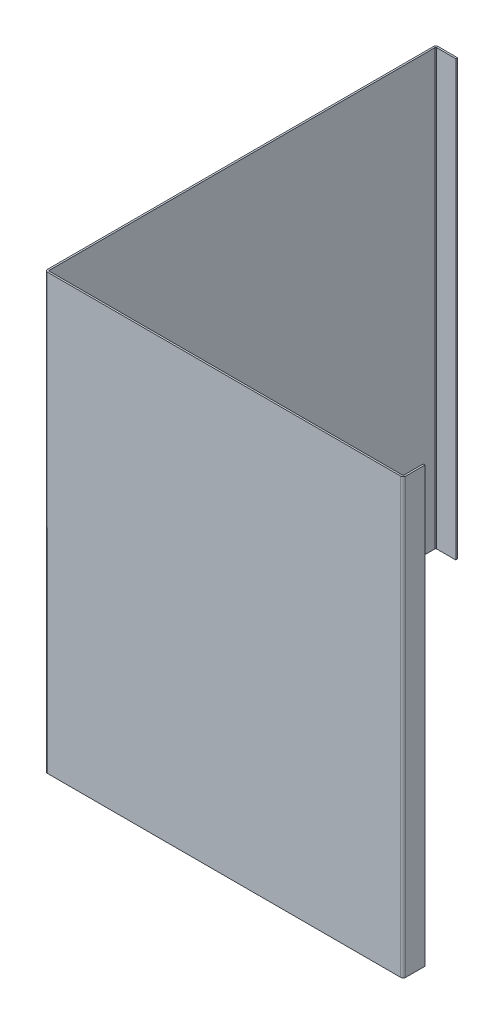
ISO-10303-21;
HEADER;
FILE_DESCRIPTION(('STEP AP214'),'2;1');
FILE_NAME('part.step','',(''),(''),'','','');
FILE_SCHEMA(('AUTOMOTIVE_DESIGN { 1 0 10303 214 1 1 1 1 }'));
ENDSEC;
DATA;
#1=APPLICATION_CONTEXT('core data for automotive mechanical design processes');
#2=APPLICATION_PROTOCOL_DEFINITION('international standard','automotive_design',2000,#1);
#3=PRODUCT_CONTEXT('',#1,'mechanical');
#4=PRODUCT('Part','Part','',(#3));
#5=PRODUCT_RELATED_PRODUCT_CATEGORY('part','',(#4));
#6=PRODUCT_DEFINITION_FORMATION('','',#4);
#7=PRODUCT_DEFINITION_CONTEXT('part definition',#1,'design');
#8=PRODUCT_DEFINITION('design','',#6,#7);
#9=PRODUCT_DEFINITION_SHAPE('','',#8);
#10=(LENGTH_UNIT() NAMED_UNIT(*) SI_UNIT(.MILLI.,.METRE.));
#11=(NAMED_UNIT(*) PLANE_ANGLE_UNIT() SI_UNIT($,.RADIAN.));
#12=(NAMED_UNIT(*) SI_UNIT($,.STERADIAN.) SOLID_ANGLE_UNIT());
#13=UNCERTAINTY_MEASURE_WITH_UNIT(LENGTH_MEASURE(1.E-05),#10,'distance_accuracy_value','');
#14=(GEOMETRIC_REPRESENTATION_CONTEXT(3) GLOBAL_UNCERTAINTY_ASSIGNED_CONTEXT((#13)) GLOBAL_UNIT_ASSIGNED_CONTEXT((#10,
#11,#12)) REPRESENTATION_CONTEXT('',''));
#15=CARTESIAN_POINT('',(0.,0.,0.));
#16=DIRECTION('',(0.,0.,1.));
#17=DIRECTION('',(1.,0.,0.));
#18=AXIS2_PLACEMENT_3D('',#15,#16,#17);
#19=CARTESIAN_POINT('',(1.5875,-200.,360.));
#20=DIRECTION('',(-1.,0.,0.));
#21=DIRECTION('',(0.,-1.,0.));
#22=AXIS2_PLACEMENT_3D('',#19,#20,#21);
#23=PLANE('',#22);
#24=DIRECTION('',(0.,1.,0.));
#25=VECTOR('',#24,1.);
#26=CARTESIAN_POINT('',(1.58749999999996,200.,2.3241));
#27=LINE('',#26,#25);
#28=CARTESIAN_POINT('',(1.58749999999996,200.,2.3241));
#29=VERTEX_POINT('',#28);
#30=CARTESIAN_POINT('',(1.58749999999996,-200.,2.3241));
#31=VERTEX_POINT('',#30);
#32=EDGE_CURVE('E265',#29,#31,#27,.F.);
#33=ORIENTED_EDGE('',*,*,#32,.F.);
#34=DIRECTION('',(0.,0.,-1.));
#35=VECTOR('',#34,1.);
#36=CARTESIAN_POINT('',(1.58749999999993,200.,360.));
#37=LINE('',#36,#35);
#38=CARTESIAN_POINT('',(1.58749999999996,200.,357.6759));
#39=VERTEX_POINT('',#38);
#40=EDGE_CURVE('E13',#39,#29,#37,.T.);
#41=ORIENTED_EDGE('',*,*,#40,.F.);
#42=DIRECTION('',(0.,-1.,0.));
#43=VECTOR('',#42,1.);
#44=CARTESIAN_POINT('',(1.58749999999996,-200.,357.6759));
#45=LINE('',#44,#43);
#46=CARTESIAN_POINT('',(1.58749999999996,-200.,357.6759));
#47=VERTEX_POINT('',#46);
#48=EDGE_CURVE('E356',#47,#39,#45,.F.);
#49=ORIENTED_EDGE('',*,*,#48,.F.);
#50=DIRECTION('',(0.,0.,-1.));
#51=VECTOR('',#50,1.);
#52=CARTESIAN_POINT('',(1.5875,-200.,360.));
#53=LINE('',#52,#51);
#54=EDGE_CURVE('E362',#47,#31,#53,.T.);
#55=ORIENTED_EDGE('',*,*,#54,.T.);
#56=EDGE_LOOP('',(#33,#41,#49,#55));
#57=FACE_BOUND('',#56,.T.);
#58=ADVANCED_FACE('F96',(#57),#23,.F.);
#59=CARTESIAN_POINT('',(0.,-200.,360.));
#60=DIRECTION('',(-1.,0.,0.));
#61=DIRECTION('',(0.,-1.,0.));
#62=AXIS2_PLACEMENT_3D('',#59,#60,#61);
#63=PLANE('',#62);
#64=DIRECTION('',(0.,0.,-1.));
#65=VECTOR('',#64,1.);
#66=CARTESIAN_POINT('',(0.,200.,360.));
#67=LINE('',#66,#65);
#68=CARTESIAN_POINT('',(0.,200.,357.6759));
#69=VERTEX_POINT('',#68);
#70=CARTESIAN_POINT('',(0.,200.,2.3241));
#71=VERTEX_POINT('',#70);
#72=EDGE_CURVE('E103',#69,#71,#67,.T.);
#73=ORIENTED_EDGE('',*,*,#72,.T.);
#74=DIRECTION('',(0.,1.,0.));
#75=VECTOR('',#74,1.);
#76=CARTESIAN_POINT('',(0.,200.,2.3241));
#77=LINE('',#76,#75);
#78=CARTESIAN_POINT('',(0.,-200.,2.3241));
#79=VERTEX_POINT('',#78);
#80=EDGE_CURVE('E252',#71,#79,#77,.F.);
#81=ORIENTED_EDGE('',*,*,#80,.T.);
#82=DIRECTION('',(0.,0.,-1.));
#83=VECTOR('',#82,1.);
#84=CARTESIAN_POINT('',(0.,-200.,360.));
#85=LINE('',#84,#83);
#86=CARTESIAN_POINT('',(0.,-200.,357.6759));
#87=VERTEX_POINT('',#86);
#88=EDGE_CURVE('E367',#87,#79,#85,.T.);
#89=ORIENTED_EDGE('',*,*,#88,.F.);
#90=DIRECTION('',(0.,-1.,0.));
#91=VECTOR('',#90,1.);
#92=CARTESIAN_POINT('',(0.,-200.,357.6759));
#93=LINE('',#92,#91);
#94=EDGE_CURVE('E345',#87,#69,#93,.F.);
#95=ORIENTED_EDGE('',*,*,#94,.T.);
#96=EDGE_LOOP('',(#73,#81,#89,#95));
#97=FACE_BOUND('',#96,.T.);
#98=ADVANCED_FACE('F372',(#97),#63,.T.);
#99=CARTESIAN_POINT('',(0.,200.,360.));
#100=DIRECTION('',(0.,1.,0.));
#101=DIRECTION('',(0.,0.,1.));
#102=AXIS2_PLACEMENT_3D('',#99,#100,#101);
#103=PLANE('',#102);
#104=ORIENTED_EDGE('',*,*,#40,.T.);
#105=DIRECTION('',(-1.,0.,0.));
#106=VECTOR('',#105,1.);
#107=CARTESIAN_POINT('',(1.58749999999996,200.,2.3241));
#108=LINE('',#107,#106);
#109=EDGE_CURVE('E259',#29,#71,#108,.T.);
#110=ORIENTED_EDGE('',*,*,#109,.T.);
#111=ORIENTED_EDGE('',*,*,#72,.F.);
#112=DIRECTION('',(-1.,0.,0.));
#113=VECTOR('',#112,1.);
#114=CARTESIAN_POINT('',(1.58749999999996,200.,357.6759));
#115=LINE('',#114,#113);
#116=EDGE_CURVE('E360',#39,#69,#115,.T.);
#117=ORIENTED_EDGE('',*,*,#116,.F.);
#118=EDGE_LOOP('',(#104,#110,#111,#117));
#119=FACE_BOUND('',#118,.T.);
#120=ADVANCED_FACE('F376',(#119),#103,.T.);
#121=CARTESIAN_POINT('',(330.,-200.,360.000000000001));
#122=DIRECTION('',(0.,1.,0.));
#123=DIRECTION('',(-1.,0.,0.));
#124=AXIS2_PLACEMENT_3D('',#121,#122,#123);
#125=PLANE('',#124);
#126=DIRECTION('',(0.,0.,1.));
#127=VECTOR('',#126,1.);
#128=CARTESIAN_POINT('',(327.6759,-200.,358.412500000001));
#129=LINE('',#128,#127);
#130=CARTESIAN_POINT('',(327.6759,-200.,358.412500000001));
#131=VERTEX_POINT('',#130);
#132=CARTESIAN_POINT('',(327.6759,-200.,360.000000000001));
#133=VERTEX_POINT('',#132);
#134=EDGE_CURVE('E312',#131,#133,#129,.T.);
#135=ORIENTED_EDGE('',*,*,#134,.T.);
#136=DIRECTION('',(1.,0.,0.));
#137=VECTOR('',#136,1.);
#138=CARTESIAN_POINT('',(-1.24959425652168E-12,-200.,360.));
#139=LINE('',#138,#137);
#140=CARTESIAN_POINT('',(2.3241,-200.,360.));
#141=VERTEX_POINT('',#140);
#142=EDGE_CURVE('E330',#141,#133,#139,.T.);
#143=ORIENTED_EDGE('',*,*,#142,.F.);
#144=DIRECTION('',(0.,0.,-1.));
#145=VECTOR('',#144,1.);
#146=CARTESIAN_POINT('',(2.3241,-200.,358.4125));
#147=LINE('',#146,#145);
#148=CARTESIAN_POINT('',(2.32409999999994,-200.,358.4125));
#149=VERTEX_POINT('',#148);
#150=EDGE_CURVE('E338',#149,#141,#147,.F.);
#151=ORIENTED_EDGE('',*,*,#150,.F.);
#152=DIRECTION('',(-1.,0.,0.));
#153=VECTOR('',#152,1.);
#154=CARTESIAN_POINT('',(330.,-200.,358.412500000001));
#155=LINE('',#154,#153);
#156=EDGE_CURVE('E334',#149,#131,#155,.F.);
#157=ORIENTED_EDGE('',*,*,#156,.T.);
#158=EDGE_LOOP('',(#135,#143,#151,#157));
#159=FACE_BOUND('',#158,.T.);
#160=ADVANCED_FACE('F420',(#159),#125,.F.);
#161=CARTESIAN_POINT('',(1.58749999999992,200.,360.));
#162=DIRECTION('',(0.,-1.,0.));
#163=DIRECTION('',(1.,0.,0.));
#164=AXIS2_PLACEMENT_3D('',#161,#162,#163);
#165=PLANE('',#164);
#166=DIRECTION('',(0.,0.,1.));
#167=VECTOR('',#166,1.);
#168=CARTESIAN_POINT('',(327.6759,200.,358.412500000001));
#169=LINE('',#168,#167);
#170=CARTESIAN_POINT('',(327.6759,200.,358.412500000001));
#171=VERTEX_POINT('',#170);
#172=CARTESIAN_POINT('',(327.6759,200.,360.000000000001));
#173=VERTEX_POINT('',#172);
#174=EDGE_CURVE('E321',#171,#173,#169,.T.);
#175=ORIENTED_EDGE('',*,*,#174,.F.);
#176=DIRECTION('',(1.,0.,0.));
#177=VECTOR('',#176,1.);
#178=CARTESIAN_POINT('',(1.58749999999993,200.,358.4125));
#179=LINE('',#178,#177);
#180=CARTESIAN_POINT('',(2.32409999999994,200.,358.4125));
#181=VERTEX_POINT('',#180);
#182=EDGE_CURVE('E332',#171,#181,#179,.F.);
#183=ORIENTED_EDGE('',*,*,#182,.T.);
#184=DIRECTION('',(0.,0.,-1.));
#185=VECTOR('',#184,1.);
#186=CARTESIAN_POINT('',(2.32409999999988,200.,360.));
#187=LINE('',#186,#185);
#188=CARTESIAN_POINT('',(2.32409999999993,200.,360.));
#189=VERTEX_POINT('',#188);
#190=EDGE_CURVE('E324',#181,#189,#187,.F.);
#191=ORIENTED_EDGE('',*,*,#190,.T.);
#192=DIRECTION('',(-1.,0.,0.));
#193=VECTOR('',#192,1.);
#194=CARTESIAN_POINT('',(-1.31720575271169E-12,200.,360.));
#195=LINE('',#194,#193);
#196=EDGE_CURVE('E327',#173,#189,#195,.T.);
#197=ORIENTED_EDGE('',*,*,#196,.F.);
#198=EDGE_LOOP('',(#175,#183,#191,#197));
#199=FACE_BOUND('',#198,.T.);
#200=ADVANCED_FACE('F443',(#199),#165,.F.);
#201=CARTESIAN_POINT('',(-1.28340000461669E-12,0.,360.));
#202=DIRECTION('',(0.,0.,-1.));
#203=DIRECTION('',(-1.,0.,0.));
#204=AXIS2_PLACEMENT_3D('',#201,#202,#203);
#205=PLANE('',#204);
#206=DIRECTION('',(0.,-1.,0.));
#207=VECTOR('',#206,1.);
#208=CARTESIAN_POINT('',(327.6759,-200.,360.000000000001));
#209=LINE('',#208,#207);
#210=EDGE_CURVE('E306',#133,#173,#209,.F.);
#211=ORIENTED_EDGE('',*,*,#210,.T.);
#212=ORIENTED_EDGE('',*,*,#196,.T.);
#213=DIRECTION('',(0.,-1.,0.));
#214=VECTOR('',#213,1.);
#215=CARTESIAN_POINT('',(2.32409999999988,200.,360.));
#216=LINE('',#215,#214);
#217=EDGE_CURVE('E336',#141,#189,#216,.F.);
#218=ORIENTED_EDGE('',*,*,#217,.F.);
#219=ORIENTED_EDGE('',*,*,#142,.T.);
#220=EDGE_LOOP('',(#211,#212,#218,#219));
#221=FACE_BOUND('',#220,.T.);
#222=ADVANCED_FACE('F447',(#221),#205,.F.);
#223=CARTESIAN_POINT('',(-1.27785727799127E-12,0.,358.4125));
#224=DIRECTION('',(0.,0.,-1.));
#225=DIRECTION('',(-1.,0.,0.));
#226=AXIS2_PLACEMENT_3D('',#223,#224,#225);
#227=PLANE('',#226);
#228=ORIENTED_EDGE('',*,*,#182,.F.);
#229=DIRECTION('',(0.,-1.,0.));
#230=VECTOR('',#229,1.);
#231=CARTESIAN_POINT('',(327.6759,-200.,358.412500000001));
#232=LINE('',#231,#230);
#233=EDGE_CURVE('E110',#131,#171,#232,.F.);
#234=ORIENTED_EDGE('',*,*,#233,.F.);
#235=ORIENTED_EDGE('',*,*,#156,.F.);
#236=DIRECTION('',(0.,-1.,0.));
#237=VECTOR('',#236,1.);
#238=CARTESIAN_POINT('',(2.32409999999988,200.,358.4125));
#239=LINE('',#238,#237);
#240=EDGE_CURVE('E341',#181,#149,#239,.T.);
#241=ORIENTED_EDGE('',*,*,#240,.F.);
#242=EDGE_LOOP('',(#228,#234,#235,#241));
#243=FACE_BOUND('',#242,.T.);
#244=ADVANCED_FACE('F425',(#243),#227,.T.);
#245=CARTESIAN_POINT('',(1.5875,-200.,360.));
#246=DIRECTION('',(0.,-1.,0.));
#247=DIRECTION('',(0.,0.,-1.));
#248=AXIS2_PLACEMENT_3D('',#245,#246,#247);
#249=PLANE('',#248);
#250=DIRECTION('',(-1.,0.,0.));
#251=VECTOR('',#250,1.);
#252=CARTESIAN_POINT('',(1.58749999999996,-200.,2.3241));
#253=LINE('',#252,#251);
#254=EDGE_CURVE('E270',#31,#79,#253,.T.);
#255=ORIENTED_EDGE('',*,*,#254,.F.);
#256=ORIENTED_EDGE('',*,*,#54,.F.);
#257=DIRECTION('',(-1.,0.,0.));
#258=VECTOR('',#257,1.);
#259=CARTESIAN_POINT('',(1.58749999999996,-200.,357.6759));
#260=LINE('',#259,#258);
#261=EDGE_CURVE('E350',#47,#87,#260,.T.);
#262=ORIENTED_EDGE('',*,*,#261,.T.);
#263=ORIENTED_EDGE('',*,*,#88,.T.);
#264=EDGE_LOOP('',(#255,#256,#262,#263));
#265=FACE_BOUND('',#264,.T.);
#266=ADVANCED_FACE('F392',(#265),#249,.T.);
#267=CARTESIAN_POINT('',(2.32409999999994,200.,357.6759));
#268=DIRECTION('',(0.,1.,0.));
#269=DIRECTION('',(0.,0.,1.));
#270=AXIS2_PLACEMENT_3D('',#267,#268,#269);
#271=PLANE('',#270);
#272=ORIENTED_EDGE('',*,*,#190,.F.);
#273=CARTESIAN_POINT('',(2.32409999999994,200.,357.6759));
#274=DIRECTION('',(0.,-1.,0.));
#275=DIRECTION('',(0.,0.,-1.));
#276=AXIS2_PLACEMENT_3D('',#273,#274,#275);
#277=CIRCLE('',#276,0.736599999999976);
#278=EDGE_CURVE('E353',#39,#181,#277,.F.);
#279=ORIENTED_EDGE('',*,*,#278,.F.);
#280=ORIENTED_EDGE('',*,*,#116,.T.);
#281=CARTESIAN_POINT('',(2.32409999999994,200.,357.6759));
#282=DIRECTION('',(0.,-1.,0.));
#283=DIRECTION('',(0.,0.,-1.));
#284=AXIS2_PLACEMENT_3D('',#281,#282,#283);
#285=CIRCLE('',#284,2.32409999999998);
#286=EDGE_CURVE('E118',#69,#189,#285,.F.);
#287=ORIENTED_EDGE('',*,*,#286,.T.);
#288=EDGE_LOOP('',(#272,#279,#280,#287));
#289=FACE_BOUND('',#288,.T.);
#290=ADVANCED_FACE('F424',(#289),#271,.T.);
#291=CARTESIAN_POINT('',(2.32409999999994,-200.,357.6759));
#292=DIRECTION('',(0.,1.,0.));
#293=DIRECTION('',(0.,0.,1.));
#294=AXIS2_PLACEMENT_3D('',#291,#292,#293);
#295=PLANE('',#294);
#296=CARTESIAN_POINT('',(2.32409999999994,-200.,357.6759));
#297=DIRECTION('',(0.,-1.,0.));
#298=DIRECTION('',(0.,0.,-1.));
#299=AXIS2_PLACEMENT_3D('',#296,#297,#298);
#300=CIRCLE('',#299,0.736599999999976);
#301=EDGE_CURVE('E329',#149,#47,#300,.T.);
#302=ORIENTED_EDGE('',*,*,#301,.F.);
#303=ORIENTED_EDGE('',*,*,#150,.T.);
#304=CARTESIAN_POINT('',(2.32409999999994,-200.,357.6759));
#305=DIRECTION('',(0.,-1.,0.));
#306=DIRECTION('',(0.,0.,-1.));
#307=AXIS2_PLACEMENT_3D('',#304,#305,#306);
#308=CIRCLE('',#307,2.32409999999998);
#309=EDGE_CURVE('E348',#141,#87,#308,.T.);
#310=ORIENTED_EDGE('',*,*,#309,.T.);
#311=ORIENTED_EDGE('',*,*,#261,.F.);
#312=EDGE_LOOP('',(#302,#303,#310,#311));
#313=FACE_BOUND('',#312,.T.);
#314=ADVANCED_FACE('F426',(#313),#295,.F.);
#315=CARTESIAN_POINT('',(2.32409999999994,-200.,357.6759));
#316=DIRECTION('',(0.,-1.,0.));
#317=DIRECTION('',(0.,0.,1.));
#318=AXIS2_PLACEMENT_3D('',#315,#316,#317);
#319=CYLINDRICAL_SURFACE('',#318,2.32409999999998);
#320=ORIENTED_EDGE('',*,*,#94,.F.);
#321=ORIENTED_EDGE('',*,*,#309,.F.);
#322=ORIENTED_EDGE('',*,*,#217,.T.);
#323=ORIENTED_EDGE('',*,*,#286,.F.);
#324=EDGE_LOOP('',(#320,#321,#322,#323));
#325=FACE_BOUND('',#324,.T.);
#326=ADVANCED_FACE('F429',(#325),#319,.T.);
#327=CARTESIAN_POINT('',(2.32409999999994,-200.,357.6759));
#328=DIRECTION('',(0.,-1.,0.));
#329=DIRECTION('',(0.,0.,1.));
#330=AXIS2_PLACEMENT_3D('',#327,#328,#329);
#331=CYLINDRICAL_SURFACE('',#330,0.736599999999976);
#332=ORIENTED_EDGE('',*,*,#48,.T.);
#333=ORIENTED_EDGE('',*,*,#278,.T.);
#334=ORIENTED_EDGE('',*,*,#240,.T.);
#335=ORIENTED_EDGE('',*,*,#301,.T.);
#336=EDGE_LOOP('',(#332,#333,#334,#335));
#337=FACE_BOUND('',#336,.T.);
#338=ADVANCED_FACE('F434',(#337),#331,.F.);
#339=CARTESIAN_POINT('',(327.6759,200.,357.675900000001));
#340=DIRECTION('',(0.,1.,0.));
#341=DIRECTION('',(0.,0.,1.));
#342=AXIS2_PLACEMENT_3D('',#339,#340,#341);
#343=PLANE('',#342);
#344=DIRECTION('',(-1.,0.,0.));
#345=VECTOR('',#344,1.);
#346=CARTESIAN_POINT('',(330.,200.,357.675900000001));
#347=LINE('',#346,#345);
#348=CARTESIAN_POINT('',(328.4125,200.,357.675900000001));
#349=VERTEX_POINT('',#348);
#350=CARTESIAN_POINT('',(330.,200.,357.675900000001));
#351=VERTEX_POINT('',#350);
#352=EDGE_CURVE('E273',#349,#351,#347,.F.);
#353=ORIENTED_EDGE('',*,*,#352,.F.);
#354=CARTESIAN_POINT('',(327.6759,200.,357.675900000001));
#355=DIRECTION('',(0.,-1.,0.));
#356=DIRECTION('',(0.,0.,-1.));
#357=AXIS2_PLACEMENT_3D('',#354,#355,#356);
#358=CIRCLE('',#357,0.736599999999921);
#359=EDGE_CURVE('E315',#171,#349,#358,.F.);
#360=ORIENTED_EDGE('',*,*,#359,.F.);
#361=ORIENTED_EDGE('',*,*,#174,.T.);
#362=CARTESIAN_POINT('',(327.6759,200.,357.675900000001));
#363=DIRECTION('',(0.,-1.,0.));
#364=DIRECTION('',(0.,0.,-1.));
#365=AXIS2_PLACEMENT_3D('',#362,#363,#364);
#366=CIRCLE('',#365,2.32409999999992);
#367=EDGE_CURVE('E308',#173,#351,#366,.F.);
#368=ORIENTED_EDGE('',*,*,#367,.T.);
#369=EDGE_LOOP('',(#353,#360,#361,#368));
#370=FACE_BOUND('',#369,.T.);
#371=ADVANCED_FACE('F437',(#370),#343,.T.);
#372=CARTESIAN_POINT('',(327.6759,-200.,357.675900000001));
#373=DIRECTION('',(0.,1.,0.));
#374=DIRECTION('',(0.,0.,1.));
#375=AXIS2_PLACEMENT_3D('',#372,#373,#374);
#376=PLANE('',#375);
#377=CARTESIAN_POINT('',(327.6759,-200.,357.675900000001));
#378=DIRECTION('',(0.,-1.,0.));
#379=DIRECTION('',(0.,0.,-1.));
#380=AXIS2_PLACEMENT_3D('',#377,#378,#379);
#381=CIRCLE('',#380,0.736599999999921);
#382=CARTESIAN_POINT('',(328.4125,-200.,357.675900000001));
#383=VERTEX_POINT('',#382);
#384=EDGE_CURVE('E279',#383,#131,#381,.T.);
#385=ORIENTED_EDGE('',*,*,#384,.F.);
#386=DIRECTION('',(-1.,0.,0.));
#387=VECTOR('',#386,1.);
#388=CARTESIAN_POINT('',(328.4125,-200.,357.675900000001));
#389=LINE('',#388,#387);
#390=CARTESIAN_POINT('',(330.,-200.,357.675900000001));
#391=VERTEX_POINT('',#390);
#392=EDGE_CURVE('E299',#383,#391,#389,.F.);
#393=ORIENTED_EDGE('',*,*,#392,.T.);
#394=CARTESIAN_POINT('',(327.6759,-200.,357.675900000001));
#395=DIRECTION('',(0.,-1.,0.));
#396=DIRECTION('',(0.,0.,-1.));
#397=AXIS2_PLACEMENT_3D('',#394,#395,#396);
#398=CIRCLE('',#397,2.32409999999992);
#399=EDGE_CURVE('E309',#391,#133,#398,.T.);
#400=ORIENTED_EDGE('',*,*,#399,.T.);
#401=ORIENTED_EDGE('',*,*,#134,.F.);
#402=EDGE_LOOP('',(#385,#393,#400,#401));
#403=FACE_BOUND('',#402,.T.);
#404=ADVANCED_FACE('F454',(#403),#376,.F.);
#405=CARTESIAN_POINT('',(327.6759,-200.,357.675900000001));
#406=DIRECTION('',(0.,-1.,0.));
#407=DIRECTION('',(1.,0.,0.));
#408=AXIS2_PLACEMENT_3D('',#405,#406,#407);
#409=CYLINDRICAL_SURFACE('',#408,2.32409999999992);
#410=ORIENTED_EDGE('',*,*,#210,.F.);
#411=ORIENTED_EDGE('',*,*,#399,.F.);
#412=DIRECTION('',(0.,-1.,0.));
#413=VECTOR('',#412,1.);
#414=CARTESIAN_POINT('',(330.,200.,357.675900000001));
#415=LINE('',#414,#413);
#416=EDGE_CURVE('E297',#391,#351,#415,.F.);
#417=ORIENTED_EDGE('',*,*,#416,.T.);
#418=ORIENTED_EDGE('',*,*,#367,.F.);
#419=EDGE_LOOP('',(#410,#411,#417,#418));
#420=FACE_BOUND('',#419,.T.);
#421=ADVANCED_FACE('F457',(#420),#409,.T.);
#422=CARTESIAN_POINT('',(327.6759,-200.,357.675900000001));
#423=DIRECTION('',(0.,-1.,0.));
#424=DIRECTION('',(1.,0.,0.));
#425=AXIS2_PLACEMENT_3D('',#422,#423,#424);
#426=CYLINDRICAL_SURFACE('',#425,0.736599999999921);
#427=ORIENTED_EDGE('',*,*,#233,.T.);
#428=ORIENTED_EDGE('',*,*,#359,.T.);
#429=DIRECTION('',(0.,-1.,0.));
#430=VECTOR('',#429,1.);
#431=CARTESIAN_POINT('',(328.4125,200.,357.675900000001));
#432=LINE('',#431,#430);
#433=EDGE_CURVE('E302',#349,#383,#432,.T.);
#434=ORIENTED_EDGE('',*,*,#433,.T.);
#435=ORIENTED_EDGE('',*,*,#384,.T.);
#436=EDGE_LOOP('',(#427,#428,#434,#435));
#437=FACE_BOUND('',#436,.T.);
#438=ADVANCED_FACE('F462',(#437),#426,.F.);
#439=CARTESIAN_POINT('',(330.,-200.,340.000000000001));
#440=DIRECTION('',(0.,1.,0.));
#441=DIRECTION('',(-1.,0.,0.));
#442=AXIS2_PLACEMENT_3D('',#439,#440,#441);
#443=PLANE('',#442);
#444=ORIENTED_EDGE('',*,*,#392,.F.);
#445=DIRECTION('',(0.,0.,1.));
#446=VECTOR('',#445,1.);
#447=CARTESIAN_POINT('',(328.4125,-200.,340.000000000001));
#448=LINE('',#447,#446);
#449=CARTESIAN_POINT('',(328.4125,-200.,340.000000000001));
#450=VERTEX_POINT('',#449);
#451=EDGE_CURVE('E295',#383,#450,#448,.F.);
#452=ORIENTED_EDGE('',*,*,#451,.T.);
#453=DIRECTION('',(-1.,0.,0.));
#454=VECTOR('',#453,1.);
#455=CARTESIAN_POINT('',(330.,-200.,340.000000000001));
#456=LINE('',#455,#454);
#457=CARTESIAN_POINT('',(330.,-200.,340.000000000001));
#458=VERTEX_POINT('',#457);
#459=EDGE_CURVE('E276',#458,#450,#456,.T.);
#460=ORIENTED_EDGE('',*,*,#459,.F.);
#461=DIRECTION('',(0.,0.,-1.));
#462=VECTOR('',#461,1.);
#463=CARTESIAN_POINT('',(330.000000000002,-200.,1.99535181352998E-12));
#464=LINE('',#463,#462);
#465=EDGE_CURVE('E288',#391,#458,#464,.T.);
#466=ORIENTED_EDGE('',*,*,#465,.F.);
#467=EDGE_LOOP('',(#444,#452,#460,#466));
#468=FACE_BOUND('',#467,.T.);
#469=ADVANCED_FACE('F465',(#468),#443,.F.);
#470=CARTESIAN_POINT('',(330.,200.,358.412500000001));
#471=DIRECTION('',(0.,-1.,0.));
#472=DIRECTION('',(1.,0.,0.));
#473=AXIS2_PLACEMENT_3D('',#470,#471,#472);
#474=PLANE('',#473);
#475=ORIENTED_EDGE('',*,*,#352,.T.);
#476=DIRECTION('',(0.,0.,1.));
#477=VECTOR('',#476,1.);
#478=CARTESIAN_POINT('',(330.000000000002,200.,1.99535181352998E-12));
#479=LINE('',#478,#477);
#480=CARTESIAN_POINT('',(330.,200.,340.000000000001));
#481=VERTEX_POINT('',#480);
#482=EDGE_CURVE('E283',#481,#351,#479,.T.);
#483=ORIENTED_EDGE('',*,*,#482,.F.);
#484=DIRECTION('',(-1.,0.,0.));
#485=VECTOR('',#484,1.);
#486=CARTESIAN_POINT('',(330.,200.,340.000000000001));
#487=LINE('',#486,#485);
#488=CARTESIAN_POINT('',(328.4125,200.,340.000000000001));
#489=VERTEX_POINT('',#488);
#490=EDGE_CURVE('E280',#481,#489,#487,.T.);
#491=ORIENTED_EDGE('',*,*,#490,.T.);
#492=DIRECTION('',(0.,0.,-1.));
#493=VECTOR('',#492,1.);
#494=CARTESIAN_POINT('',(328.4125,200.,358.412500000001));
#495=LINE('',#494,#493);
#496=EDGE_CURVE('E290',#489,#349,#495,.F.);
#497=ORIENTED_EDGE('',*,*,#496,.T.);
#498=EDGE_LOOP('',(#475,#483,#491,#497));
#499=FACE_BOUND('',#498,.T.);
#500=ADVANCED_FACE('F472',(#499),#474,.F.);
#501=CARTESIAN_POINT('',(330.000000000002,0.,1.99535181352998E-12));
#502=DIRECTION('',(-1.,0.,0.));
#503=DIRECTION('',(0.,0.,1.));
#504=AXIS2_PLACEMENT_3D('',#501,#502,#503);
#505=PLANE('',#504);
#506=ORIENTED_EDGE('',*,*,#416,.F.);
#507=ORIENTED_EDGE('',*,*,#465,.T.);
#508=DIRECTION('',(0.,1.,0.));
#509=VECTOR('',#508,1.);
#510=CARTESIAN_POINT('',(330.,0.,340.000000000001));
#511=LINE('',#510,#509);
#512=EDGE_CURVE('E286',#458,#481,#511,.T.);
#513=ORIENTED_EDGE('',*,*,#512,.T.);
#514=ORIENTED_EDGE('',*,*,#482,.T.);
#515=EDGE_LOOP('',(#506,#507,#513,#514));
#516=FACE_BOUND('',#515,.T.);
#517=ADVANCED_FACE('F481',(#516),#505,.F.);
#518=CARTESIAN_POINT('',(328.412500000002,0.,1.98417409126898E-12));
#519=DIRECTION('',(-1.,0.,0.));
#520=DIRECTION('',(0.,0.,1.));
#521=AXIS2_PLACEMENT_3D('',#518,#519,#520);
#522=PLANE('',#521);
#523=ORIENTED_EDGE('',*,*,#451,.F.);
#524=ORIENTED_EDGE('',*,*,#433,.F.);
#525=ORIENTED_EDGE('',*,*,#496,.F.);
#526=DIRECTION('',(0.,-1.,0.));
#527=VECTOR('',#526,1.);
#528=CARTESIAN_POINT('',(328.4125,200.,340.000000000001));
#529=LINE('',#528,#527);
#530=EDGE_CURVE('E293',#450,#489,#529,.F.);
#531=ORIENTED_EDGE('',*,*,#530,.F.);
#532=EDGE_LOOP('',(#523,#524,#525,#531));
#533=FACE_BOUND('',#532,.T.);
#534=ADVANCED_FACE('F477',(#533),#522,.T.);
#535=CARTESIAN_POINT('',(330.,200.,340.000000000001));
#536=DIRECTION('',(0.,0.,1.));
#537=DIRECTION('',(1.,0.,0.));
#538=AXIS2_PLACEMENT_3D('',#535,#536,#537);
#539=PLANE('',#538);
#540=ORIENTED_EDGE('',*,*,#530,.T.);
#541=ORIENTED_EDGE('',*,*,#490,.F.);
#542=ORIENTED_EDGE('',*,*,#512,.F.);
#543=ORIENTED_EDGE('',*,*,#459,.T.);
#544=EDGE_LOOP('',(#540,#541,#542,#543));
#545=FACE_BOUND('',#544,.T.);
#546=ADVANCED_FACE('F474',(#545),#539,.F.);
#547=CARTESIAN_POINT('',(2.32409999999996,-200.,2.3241));
#548=DIRECTION('',(0.,-1.,0.));
#549=DIRECTION('',(0.,0.,-1.));
#550=AXIS2_PLACEMENT_3D('',#547,#548,#549);
#551=PLANE('',#550);
#552=DIRECTION('',(0.,0.,1.));
#553=VECTOR('',#552,1.);
#554=CARTESIAN_POINT('',(2.3241,-200.,0.));
#555=LINE('',#554,#553);
#556=CARTESIAN_POINT('',(2.32409999999996,-200.,1.5875));
#557=VERTEX_POINT('',#556);
#558=CARTESIAN_POINT('',(2.32409999999995,-200.,0.));
#559=VERTEX_POINT('',#558);
#560=EDGE_CURVE('E235',#557,#559,#555,.F.);
#561=ORIENTED_EDGE('',*,*,#560,.F.);
#562=CARTESIAN_POINT('',(2.32409999999996,-200.,2.3241));
#563=DIRECTION('',(0.,1.,0.));
#564=DIRECTION('',(0.,0.,1.));
#565=AXIS2_PLACEMENT_3D('',#562,#563,#564);
#566=CIRCLE('',#565,0.7366);
#567=EDGE_CURVE('E262',#31,#557,#566,.F.);
#568=ORIENTED_EDGE('',*,*,#567,.F.);
#569=ORIENTED_EDGE('',*,*,#254,.T.);
#570=CARTESIAN_POINT('',(2.32409999999996,-200.,2.3241));
#571=DIRECTION('',(0.,1.,0.));
#572=DIRECTION('',(0.,0.,1.));
#573=AXIS2_PLACEMENT_3D('',#570,#571,#572);
#574=CIRCLE('',#573,2.3241);
#575=EDGE_CURVE('E255',#79,#559,#574,.F.);
#576=ORIENTED_EDGE('',*,*,#575,.T.);
#577=EDGE_LOOP('',(#561,#568,#569,#576));
#578=FACE_BOUND('',#577,.T.);
#579=ADVANCED_FACE('F394',(#578),#551,.T.);
#580=CARTESIAN_POINT('',(2.32409999999996,200.,2.3241));
#581=DIRECTION('',(0.,-1.,0.));
#582=DIRECTION('',(0.,0.,-1.));
#583=AXIS2_PLACEMENT_3D('',#580,#581,#582);
#584=PLANE('',#583);
#585=CARTESIAN_POINT('',(2.32409999999996,200.,2.3241));
#586=DIRECTION('',(0.,1.,0.));
#587=DIRECTION('',(0.,0.,1.));
#588=AXIS2_PLACEMENT_3D('',#585,#586,#587);
#589=CIRCLE('',#588,0.7366);
#590=CARTESIAN_POINT('',(2.32409999999996,200.,1.5875));
#591=VERTEX_POINT('',#590);
#592=EDGE_CURVE('E267',#591,#29,#589,.T.);
#593=ORIENTED_EDGE('',*,*,#592,.F.);
#594=DIRECTION('',(0.,0.,1.));
#595=VECTOR('',#594,1.);
#596=CARTESIAN_POINT('',(2.32409999999992,200.,1.5875));
#597=LINE('',#596,#595);
#598=CARTESIAN_POINT('',(2.32409999999992,200.,0.));
#599=VERTEX_POINT('',#598);
#600=EDGE_CURVE('E246',#591,#599,#597,.F.);
#601=ORIENTED_EDGE('',*,*,#600,.T.);
#602=CARTESIAN_POINT('',(2.32409999999996,200.,2.3241));
#603=DIRECTION('',(0.,1.,0.));
#604=DIRECTION('',(0.,0.,1.));
#605=AXIS2_PLACEMENT_3D('',#602,#603,#604);
#606=CIRCLE('',#605,2.3241);
#607=EDGE_CURVE('E256',#599,#71,#606,.T.);
#608=ORIENTED_EDGE('',*,*,#607,.T.);
#609=ORIENTED_EDGE('',*,*,#109,.F.);
#610=EDGE_LOOP('',(#593,#601,#608,#609));
#611=FACE_BOUND('',#610,.T.);
#612=ADVANCED_FACE('F380',(#611),#584,.F.);
#613=CARTESIAN_POINT('',(2.32409999999996,200.,2.3241));
#614=DIRECTION('',(0.,1.,0.));
#615=DIRECTION('',(0.,0.,-1.));
#616=AXIS2_PLACEMENT_3D('',#613,#614,#615);
#617=CYLINDRICAL_SURFACE('',#616,2.3241);
#618=ORIENTED_EDGE('',*,*,#80,.F.);
#619=ORIENTED_EDGE('',*,*,#607,.F.);
#620=DIRECTION('',(0.,1.,0.));
#621=VECTOR('',#620,1.);
#622=CARTESIAN_POINT('',(2.3241,-200.,0.));
#623=LINE('',#622,#621);
#624=EDGE_CURVE('E244',#599,#559,#623,.F.);
#625=ORIENTED_EDGE('',*,*,#624,.T.);
#626=ORIENTED_EDGE('',*,*,#575,.F.);
#627=EDGE_LOOP('',(#618,#619,#625,#626));
#628=FACE_BOUND('',#627,.T.);
#629=ADVANCED_FACE('F402',(#628),#617,.T.);
#630=CARTESIAN_POINT('',(2.32409999999996,200.,2.3241));
#631=DIRECTION('',(0.,1.,0.));
#632=DIRECTION('',(0.,0.,-1.));
#633=AXIS2_PLACEMENT_3D('',#630,#631,#632);
#634=CYLINDRICAL_SURFACE('',#633,0.7366);
#635=ORIENTED_EDGE('',*,*,#32,.T.);
#636=ORIENTED_EDGE('',*,*,#567,.T.);
#637=DIRECTION('',(0.,1.,0.));
#638=VECTOR('',#637,1.);
#639=CARTESIAN_POINT('',(2.3241,-200.,1.5875));
#640=LINE('',#639,#638);
#641=EDGE_CURVE('E249',#557,#591,#640,.T.);
#642=ORIENTED_EDGE('',*,*,#641,.T.);
#643=ORIENTED_EDGE('',*,*,#592,.T.);
#644=EDGE_LOOP('',(#635,#636,#642,#643));
#645=FACE_BOUND('',#644,.T.);
#646=ADVANCED_FACE('F384',(#645),#634,.F.);
#647=CARTESIAN_POINT('',(1.58749999999999,-200.,0.));
#648=DIRECTION('',(0.,1.,0.));
#649=DIRECTION('',(0.,0.,1.));
#650=AXIS2_PLACEMENT_3D('',#647,#648,#649);
#651=PLANE('',#650);
#652=ORIENTED_EDGE('',*,*,#560,.T.);
#653=DIRECTION('',(-1.,0.,0.));
#654=VECTOR('',#653,1.);
#655=CARTESIAN_POINT('',(0.,-200.,0.));
#656=LINE('',#655,#654);
#657=CARTESIAN_POINT('',(20.,-200.,0.));
#658=VERTEX_POINT('',#657);
#659=EDGE_CURVE('E216',#658,#559,#656,.T.);
#660=ORIENTED_EDGE('',*,*,#659,.F.);
#661=DIRECTION('',(0.,0.,1.));
#662=VECTOR('',#661,1.);
#663=CARTESIAN_POINT('',(20.,-200.,0.));
#664=LINE('',#663,#662);
#665=CARTESIAN_POINT('',(20.,-200.,1.58749999999994));
#666=VERTEX_POINT('',#665);
#667=EDGE_CURVE('E222',#658,#666,#664,.T.);
#668=ORIENTED_EDGE('',*,*,#667,.T.);
#669=DIRECTION('',(1.,0.,0.));
#670=VECTOR('',#669,1.);
#671=CARTESIAN_POINT('',(1.5875,-200.,1.5875));
#672=LINE('',#671,#670);
#673=EDGE_CURVE('E242',#666,#557,#672,.F.);
#674=ORIENTED_EDGE('',*,*,#673,.T.);
#675=EDGE_LOOP('',(#652,#660,#668,#674));
#676=FACE_BOUND('',#675,.T.);
#677=ADVANCED_FACE('F234',(#676),#651,.F.);
#678=CARTESIAN_POINT('',(19.9999999999999,200.,0.));
#679=DIRECTION('',(0.,-1.,0.));
#680=DIRECTION('',(0.,0.,-1.));
#681=AXIS2_PLACEMENT_3D('',#678,#679,#680);
#682=PLANE('',#681);
#683=ORIENTED_EDGE('',*,*,#600,.F.);
#684=DIRECTION('',(-1.,0.,0.));
#685=VECTOR('',#684,1.);
#686=CARTESIAN_POINT('',(19.9999999999999,200.,1.58749999999994));
#687=LINE('',#686,#685);
#688=CARTESIAN_POINT('',(19.9999999999999,200.,1.58749999999994));
#689=VERTEX_POINT('',#688);
#690=EDGE_CURVE('E238',#591,#689,#687,.F.);
#691=ORIENTED_EDGE('',*,*,#690,.T.);
#692=DIRECTION('',(0.,0.,1.));
#693=VECTOR('',#692,1.);
#694=CARTESIAN_POINT('',(19.9999999999999,200.,0.));
#695=LINE('',#694,#693);
#696=CARTESIAN_POINT('',(19.9999999999999,200.,0.));
#697=VERTEX_POINT('',#696);
#698=EDGE_CURVE('E231',#697,#689,#695,.T.);
#699=ORIENTED_EDGE('',*,*,#698,.F.);
#700=DIRECTION('',(1.,0.,0.));
#701=VECTOR('',#700,1.);
#702=CARTESIAN_POINT('',(0.,200.,0.));
#703=LINE('',#702,#701);
#704=EDGE_CURVE('E218',#599,#697,#703,.T.);
#705=ORIENTED_EDGE('',*,*,#704,.F.);
#706=EDGE_LOOP('',(#683,#691,#699,#705));
#707=FACE_BOUND('',#706,.T.);
#708=ADVANCED_FACE('F399',(#707),#682,.F.);
#709=CARTESIAN_POINT('',(0.,0.,0.));
#710=DIRECTION('',(0.,0.,1.));
#711=DIRECTION('',(1.,0.,0.));
#712=AXIS2_PLACEMENT_3D('',#709,#710,#711);
#713=PLANE('',#712);
#714=ORIENTED_EDGE('',*,*,#624,.F.);
#715=ORIENTED_EDGE('',*,*,#704,.T.);
#716=DIRECTION('',(0.,-1.,0.));
#717=VECTOR('',#716,1.);
#718=CARTESIAN_POINT('',(20.,0.,0.));
#719=LINE('',#718,#717);
#720=EDGE_CURVE('E211',#697,#658,#719,.T.);
#721=ORIENTED_EDGE('',*,*,#720,.T.);
#722=ORIENTED_EDGE('',*,*,#659,.T.);
#723=EDGE_LOOP('',(#714,#715,#721,#722));
#724=FACE_BOUND('',#723,.T.);
#725=ADVANCED_FACE('F214',(#724),#713,.F.);
#726=CARTESIAN_POINT('',(0.,0.,1.58750000000001));
#727=DIRECTION('',(0.,0.,1.));
#728=DIRECTION('',(1.,0.,0.));
#729=AXIS2_PLACEMENT_3D('',#726,#727,#728);
#730=PLANE('',#729);
#731=ORIENTED_EDGE('',*,*,#690,.F.);
#732=ORIENTED_EDGE('',*,*,#641,.F.);
#733=ORIENTED_EDGE('',*,*,#673,.F.);
#734=DIRECTION('',(0.,1.,0.));
#735=VECTOR('',#734,1.);
#736=CARTESIAN_POINT('',(20.,-200.,1.58749999999994));
#737=LINE('',#736,#735);
#738=EDGE_CURVE('E227',#689,#666,#737,.F.);
#739=ORIENTED_EDGE('',*,*,#738,.F.);
#740=EDGE_LOOP('',(#731,#732,#733,#739));
#741=FACE_BOUND('',#740,.T.);
#742=ADVANCED_FACE('F397',(#741),#730,.T.);
#743=CARTESIAN_POINT('',(20.,-200.,0.));
#744=DIRECTION('',(-1.,0.,0.));
#745=DIRECTION('',(0.,0.,1.));
#746=AXIS2_PLACEMENT_3D('',#743,#744,#745);
#747=PLANE('',#746);
#748=ORIENTED_EDGE('',*,*,#738,.T.);
#749=ORIENTED_EDGE('',*,*,#667,.F.);
#750=ORIENTED_EDGE('',*,*,#720,.F.);
#751=ORIENTED_EDGE('',*,*,#698,.T.);
#752=EDGE_LOOP('',(#748,#749,#750,#751));
#753=FACE_BOUND('',#752,.T.);
#754=ADVANCED_FACE('F225',(#753),#747,.F.);
#755=CLOSED_SHELL('',(#58,#98,#120,#160,#200,#222,#244,#266,#290,#314,#326,#338,#371,#404,#421,
#438,#469,#500,#517,#534,#546,#579,#612,#629,#646,#677,#708,#725,#742,#754));
#756=MANIFOLD_SOLID_BREP('B2',#755);
#757=ADVANCED_BREP_SHAPE_REPRESENTATION('',(#18,#756),#14);
#758=SHAPE_DEFINITION_REPRESENTATION(#9,#757);
ENDSEC;
END-ISO-10303-21;
